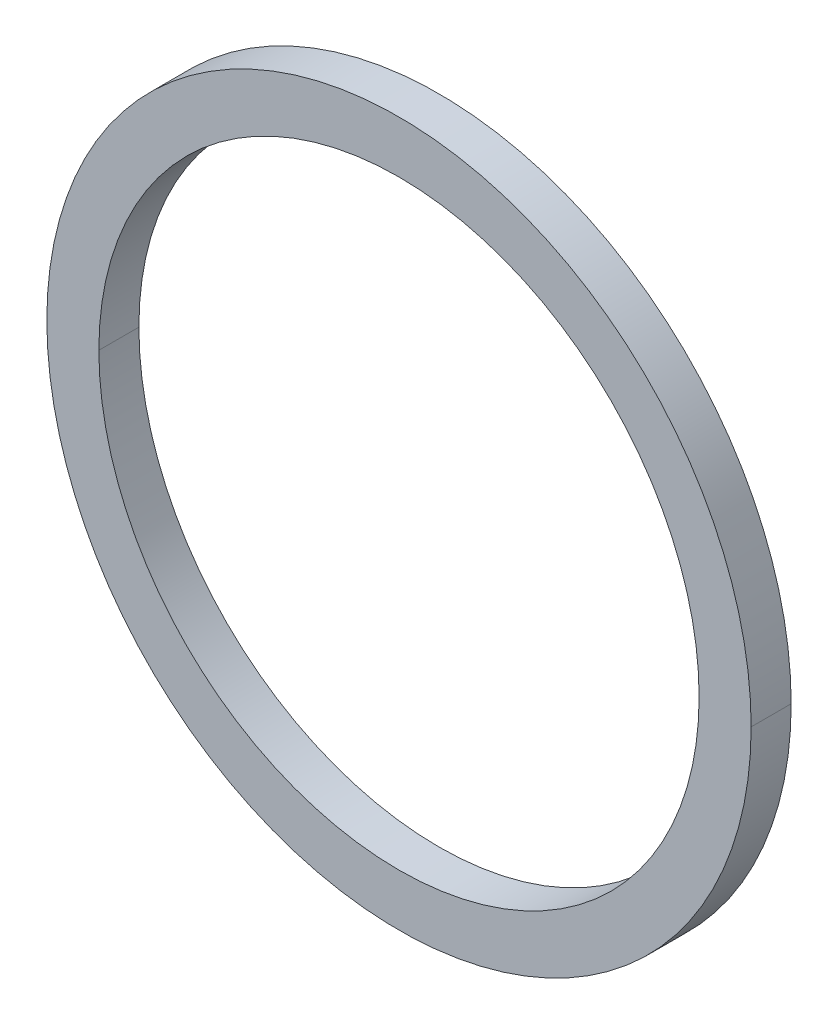
ISO-10303-21;
HEADER;
FILE_DESCRIPTION(('STEP AP214'),'2;1');
FILE_NAME('part.step','',(''),(''),'','','');
FILE_SCHEMA(('AUTOMOTIVE_DESIGN { 1 0 10303 214 1 1 1 1 }'));
ENDSEC;
DATA;
#1=APPLICATION_CONTEXT('core data for automotive mechanical design processes');
#2=APPLICATION_PROTOCOL_DEFINITION('international standard','automotive_design',2000,#1);
#3=PRODUCT_CONTEXT('',#1,'mechanical');
#4=PRODUCT('Part','Part','',(#3));
#5=PRODUCT_RELATED_PRODUCT_CATEGORY('part','',(#4));
#6=PRODUCT_DEFINITION_FORMATION('','',#4);
#7=PRODUCT_DEFINITION_CONTEXT('part definition',#1,'design');
#8=PRODUCT_DEFINITION('design','',#6,#7);
#9=PRODUCT_DEFINITION_SHAPE('','',#8);
#10=(LENGTH_UNIT() NAMED_UNIT(*) SI_UNIT(.MILLI.,.METRE.));
#11=(NAMED_UNIT(*) PLANE_ANGLE_UNIT() SI_UNIT($,.RADIAN.));
#12=(NAMED_UNIT(*) SI_UNIT($,.STERADIAN.) SOLID_ANGLE_UNIT());
#13=UNCERTAINTY_MEASURE_WITH_UNIT(LENGTH_MEASURE(1.E-05),#10,'distance_accuracy_value','');
#14=(GEOMETRIC_REPRESENTATION_CONTEXT(3) GLOBAL_UNCERTAINTY_ASSIGNED_CONTEXT((#13)) GLOBAL_UNIT_ASSIGNED_CONTEXT((#10,
#11,#12)) REPRESENTATION_CONTEXT('',''));
#15=CARTESIAN_POINT('',(0.,0.,0.));
#16=DIRECTION('',(0.,0.,1.));
#17=DIRECTION('',(1.,0.,0.));
#18=AXIS2_PLACEMENT_3D('',#15,#16,#17);
#19=CARTESIAN_POINT('',(0.,0.,1.));
#20=DIRECTION('',(0.,0.,-1.));
#21=DIRECTION('',(-1.,0.,0.));
#22=AXIS2_PLACEMENT_3D('',#19,#20,#21);
#23=CYLINDRICAL_SURFACE('',#22,7.5);
#24=DIRECTION('',(0.,0.,-1.));
#25=VECTOR('',#24,1.);
#26=CARTESIAN_POINT('',(7.5,0.,1.));
#27=LINE('',#26,#25);
#28=CARTESIAN_POINT('',(7.5,0.,1.));
#29=VERTEX_POINT('',#28);
#30=CARTESIAN_POINT('',(7.5,0.,0.));
#31=VERTEX_POINT('',#30);
#32=EDGE_CURVE('E89',#29,#31,#27,.T.);
#33=ORIENTED_EDGE('',*,*,#32,.F.);
#34=CARTESIAN_POINT('',(0.,0.,1.));
#35=DIRECTION('',(0.,0.,1.));
#36=DIRECTION('',(1.,0.,0.));
#37=AXIS2_PLACEMENT_3D('',#34,#35,#36);
#38=CIRCLE('',#37,7.5);
#39=CARTESIAN_POINT('',(-7.5,0.,1.));
#40=VERTEX_POINT('',#39);
#41=EDGE_CURVE('E21',#29,#40,#38,.T.);
#42=ORIENTED_EDGE('',*,*,#41,.T.);
#43=DIRECTION('',(0.,0.,-1.));
#44=VECTOR('',#43,1.);
#45=CARTESIAN_POINT('',(-7.5,0.,1.));
#46=LINE('',#45,#44);
#47=CARTESIAN_POINT('',(-7.5,0.,0.));
#48=VERTEX_POINT('',#47);
#49=EDGE_CURVE('E81',#40,#48,#46,.T.);
#50=ORIENTED_EDGE('',*,*,#49,.T.);
#51=CARTESIAN_POINT('',(0.,0.,0.));
#52=DIRECTION('',(0.,0.,1.));
#53=DIRECTION('',(1.,0.,0.));
#54=AXIS2_PLACEMENT_3D('',#51,#52,#53);
#55=CIRCLE('',#54,7.5);
#56=EDGE_CURVE('E11',#31,#48,#55,.T.);
#57=ORIENTED_EDGE('',*,*,#56,.F.);
#58=EDGE_LOOP('',(#33,#42,#50,#57));
#59=FACE_BOUND('',#58,.T.);
#60=ADVANCED_FACE('F17',(#59),#23,.F.);
#61=CARTESIAN_POINT('',(0.,0.,1.));
#62=DIRECTION('',(0.,0.,-1.));
#63=DIRECTION('',(-1.,0.,0.));
#64=AXIS2_PLACEMENT_3D('',#61,#62,#63);
#65=CYLINDRICAL_SURFACE('',#64,8.8);
#66=DIRECTION('',(0.,0.,-1.));
#67=VECTOR('',#66,1.);
#68=CARTESIAN_POINT('',(8.8,0.,1.));
#69=LINE('',#68,#67);
#70=CARTESIAN_POINT('',(8.8,0.,1.));
#71=VERTEX_POINT('',#70);
#72=CARTESIAN_POINT('',(8.8,0.,0.));
#73=VERTEX_POINT('',#72);
#74=EDGE_CURVE('E101',#71,#73,#69,.T.);
#75=ORIENTED_EDGE('',*,*,#74,.F.);
#76=CARTESIAN_POINT('',(0.,0.,1.));
#77=DIRECTION('',(0.,0.,1.));
#78=DIRECTION('',(1.,0.,0.));
#79=AXIS2_PLACEMENT_3D('',#76,#77,#78);
#80=CIRCLE('',#79,8.8);
#81=CARTESIAN_POINT('',(-8.8,0.,1.));
#82=VERTEX_POINT('',#81);
#83=EDGE_CURVE('E107',#82,#71,#80,.T.);
#84=ORIENTED_EDGE('',*,*,#83,.F.);
#85=DIRECTION('',(0.,0.,-1.));
#86=VECTOR('',#85,1.);
#87=CARTESIAN_POINT('',(-8.8,0.,1.));
#88=LINE('',#87,#86);
#89=CARTESIAN_POINT('',(-8.8,0.,0.));
#90=VERTEX_POINT('',#89);
#91=EDGE_CURVE('E110',#82,#90,#88,.T.);
#92=ORIENTED_EDGE('',*,*,#91,.T.);
#93=CARTESIAN_POINT('',(0.,0.,0.));
#94=DIRECTION('',(0.,0.,1.));
#95=DIRECTION('',(1.,0.,0.));
#96=AXIS2_PLACEMENT_3D('',#93,#94,#95);
#97=CIRCLE('',#96,8.8);
#98=EDGE_CURVE('E27',#90,#73,#97,.T.);
#99=ORIENTED_EDGE('',*,*,#98,.T.);
#100=EDGE_LOOP('',(#75,#84,#92,#99));
#101=FACE_BOUND('',#100,.T.);
#102=ADVANCED_FACE('F19',(#101),#65,.T.);
#103=CARTESIAN_POINT('',(0.,0.,0.));
#104=DIRECTION('',(0.,0.,1.));
#105=DIRECTION('',(1.,0.,0.));
#106=AXIS2_PLACEMENT_3D('',#103,#104,#105);
#107=PLANE('',#106);
#108=CARTESIAN_POINT('',(0.,0.,0.));
#109=DIRECTION('',(0.,0.,1.));
#110=DIRECTION('',(1.,0.,0.));
#111=AXIS2_PLACEMENT_3D('',#108,#109,#110);
#112=CIRCLE('',#111,7.5);
#113=EDGE_CURVE('E76',#48,#31,#112,.T.);
#114=ORIENTED_EDGE('',*,*,#113,.T.);
#115=ORIENTED_EDGE('',*,*,#56,.T.);
#116=EDGE_LOOP('',(#114,#115));
#117=FACE_BOUND('',#116,.T.);
#118=ORIENTED_EDGE('',*,*,#98,.F.);
#119=CARTESIAN_POINT('',(0.,0.,0.));
#120=DIRECTION('',(0.,0.,1.));
#121=DIRECTION('',(1.,0.,0.));
#122=AXIS2_PLACEMENT_3D('',#119,#120,#121);
#123=CIRCLE('',#122,8.8);
#124=EDGE_CURVE('E106',#73,#90,#123,.T.);
#125=ORIENTED_EDGE('',*,*,#124,.F.);
#126=EDGE_LOOP('',(#118,#125));
#127=FACE_BOUND('',#126,.T.);
#128=ADVANCED_FACE('F74',(#117,#127),#107,.F.);
#129=CARTESIAN_POINT('',(0.,0.,1.));
#130=DIRECTION('',(0.,0.,1.));
#131=DIRECTION('',(1.,0.,0.));
#132=AXIS2_PLACEMENT_3D('',#129,#130,#131);
#133=PLANE('',#132);
#134=CARTESIAN_POINT('',(0.,0.,1.));
#135=DIRECTION('',(0.,0.,1.));
#136=DIRECTION('',(1.,0.,0.));
#137=AXIS2_PLACEMENT_3D('',#134,#135,#136);
#138=CIRCLE('',#137,7.5);
#139=EDGE_CURVE('E95',#40,#29,#138,.T.);
#140=ORIENTED_EDGE('',*,*,#139,.F.);
#141=ORIENTED_EDGE('',*,*,#41,.F.);
#142=EDGE_LOOP('',(#140,#141));
#143=FACE_BOUND('',#142,.T.);
#144=ORIENTED_EDGE('',*,*,#83,.T.);
#145=CARTESIAN_POINT('',(0.,0.,1.));
#146=DIRECTION('',(0.,0.,1.));
#147=DIRECTION('',(1.,0.,0.));
#148=AXIS2_PLACEMENT_3D('',#145,#146,#147);
#149=CIRCLE('',#148,8.8);
#150=EDGE_CURVE('E86',#71,#82,#149,.T.);
#151=ORIENTED_EDGE('',*,*,#150,.T.);
#152=EDGE_LOOP('',(#144,#151));
#153=FACE_BOUND('',#152,.T.);
#154=ADVANCED_FACE('F140',(#143,#153),#133,.T.);
#155=CARTESIAN_POINT('',(0.,0.,1.));
#156=DIRECTION('',(0.,0.,-1.));
#157=DIRECTION('',(-1.,0.,0.));
#158=AXIS2_PLACEMENT_3D('',#155,#156,#157);
#159=CYLINDRICAL_SURFACE('',#158,8.8);
#160=ORIENTED_EDGE('',*,*,#150,.F.);
#161=ORIENTED_EDGE('',*,*,#74,.T.);
#162=ORIENTED_EDGE('',*,*,#124,.T.);
#163=ORIENTED_EDGE('',*,*,#91,.F.);
#164=EDGE_LOOP('',(#160,#161,#162,#163));
#165=FACE_BOUND('',#164,.T.);
#166=ADVANCED_FACE('F129',(#165),#159,.T.);
#167=CARTESIAN_POINT('',(0.,0.,1.));
#168=DIRECTION('',(0.,0.,-1.));
#169=DIRECTION('',(-1.,0.,0.));
#170=AXIS2_PLACEMENT_3D('',#167,#168,#169);
#171=CYLINDRICAL_SURFACE('',#170,7.5);
#172=ORIENTED_EDGE('',*,*,#139,.T.);
#173=ORIENTED_EDGE('',*,*,#32,.T.);
#174=ORIENTED_EDGE('',*,*,#113,.F.);
#175=ORIENTED_EDGE('',*,*,#49,.F.);
#176=EDGE_LOOP('',(#172,#173,#174,#175));
#177=FACE_BOUND('',#176,.T.);
#178=ADVANCED_FACE('F88',(#177),#171,.F.);
#179=CLOSED_SHELL('',(#60,#102,#128,#154,#166,#178));
#180=MANIFOLD_SOLID_BREP('B1',#179);
#181=ADVANCED_BREP_SHAPE_REPRESENTATION('',(#18,#180),#14);
#182=SHAPE_DEFINITION_REPRESENTATION(#9,#181);
ENDSEC;
END-ISO-10303-21;
